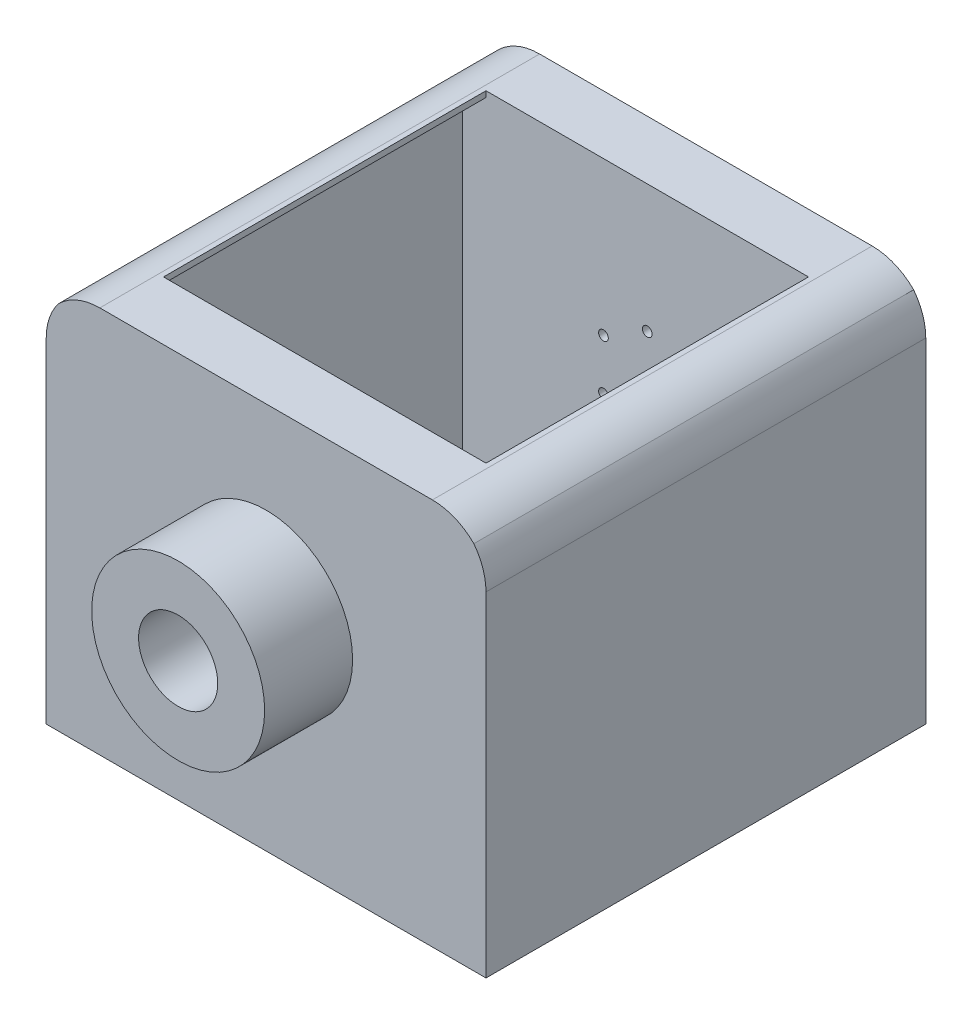
ISO-10303-21;
HEADER;
FILE_DESCRIPTION(('STEP AP214'),'2;1');
FILE_NAME('part.step','',(''),(''),'','','');
FILE_SCHEMA(('AUTOMOTIVE_DESIGN { 1 0 10303 214 1 1 1 1 }'));
ENDSEC;
DATA;
#1=APPLICATION_CONTEXT('core data for automotive mechanical design processes');
#2=APPLICATION_PROTOCOL_DEFINITION('international standard','automotive_design',2000,#1);
#3=PRODUCT_CONTEXT('',#1,'mechanical');
#4=PRODUCT('Part','Part','',(#3));
#5=PRODUCT_RELATED_PRODUCT_CATEGORY('part','',(#4));
#6=PRODUCT_DEFINITION_FORMATION('','',#4);
#7=PRODUCT_DEFINITION_CONTEXT('part definition',#1,'design');
#8=PRODUCT_DEFINITION('design','',#6,#7);
#9=PRODUCT_DEFINITION_SHAPE('','',#8);
#10=(LENGTH_UNIT() NAMED_UNIT(*) SI_UNIT(.MILLI.,.METRE.));
#11=(NAMED_UNIT(*) PLANE_ANGLE_UNIT() SI_UNIT($,.RADIAN.));
#12=(NAMED_UNIT(*) SI_UNIT($,.STERADIAN.) SOLID_ANGLE_UNIT());
#13=UNCERTAINTY_MEASURE_WITH_UNIT(LENGTH_MEASURE(1.E-05),#10,'distance_accuracy_value','');
#14=(GEOMETRIC_REPRESENTATION_CONTEXT(3) GLOBAL_UNCERTAINTY_ASSIGNED_CONTEXT((#13)) GLOBAL_UNIT_ASSIGNED_CONTEXT((#10,
#11,#12)) REPRESENTATION_CONTEXT('',''));
#15=CARTESIAN_POINT('',(0.,0.,0.));
#16=DIRECTION('',(0.,0.,1.));
#17=DIRECTION('',(1.,0.,0.));
#18=AXIS2_PLACEMENT_3D('',#15,#16,#17);
#19=CARTESIAN_POINT('',(0.,0.,-110.));
#20=DIRECTION('',(0.,0.,-1.));
#21=DIRECTION('',(-1.,0.,0.));
#22=AXIS2_PLACEMENT_3D('',#19,#20,#21);
#23=PLANE('',#22);
#24=DIRECTION('',(-1.,0.,0.));
#25=VECTOR('',#24,1.);
#26=CARTESIAN_POINT('',(0.,57.9144486749212,-110.));
#27=LINE('',#26,#25);
#28=CARTESIAN_POINT('',(63.,57.9144486749212,-110.));
#29=VERTEX_POINT('',#28);
#30=CARTESIAN_POINT('',(-63.,57.9144486749212,-110.));
#31=VERTEX_POINT('',#30);
#32=EDGE_CURVE('E123',#29,#31,#27,.T.);
#33=ORIENTED_EDGE('',*,*,#32,.F.);
#34=DIRECTION('',(0.,-1.,0.));
#35=VECTOR('',#34,1.);
#36=CARTESIAN_POINT('',(63.,200.,-110.));
#37=LINE('',#36,#35);
#38=CARTESIAN_POINT('',(63.,188.,-110.));
#39=VERTEX_POINT('',#38);
#40=EDGE_CURVE('E302',#39,#29,#37,.T.);
#41=ORIENTED_EDGE('',*,*,#40,.F.);
#42=DIRECTION('',(1.,0.,0.));
#43=VECTOR('',#42,1.);
#44=CARTESIAN_POINT('',(-75.,188.,-110.));
#45=LINE('',#44,#43);
#46=CARTESIAN_POINT('',(55.,188.,-110.));
#47=VERTEX_POINT('',#46);
#48=EDGE_CURVE('E263',#47,#39,#45,.T.);
#49=ORIENTED_EDGE('',*,*,#48,.F.);
#50=DIRECTION('',(0.,-1.,0.));
#51=VECTOR('',#50,1.);
#52=CARTESIAN_POINT('',(55.,200.,-110.));
#53=LINE('',#52,#51);
#54=CARTESIAN_POINT('',(55.,190.,-110.));
#55=VERTEX_POINT('',#54);
#56=EDGE_CURVE('E250',#55,#47,#53,.T.);
#57=ORIENTED_EDGE('',*,*,#56,.F.);
#58=DIRECTION('',(-1.,0.,0.));
#59=VECTOR('',#58,1.);
#60=CARTESIAN_POINT('',(0.,190.,-110.));
#61=LINE('',#60,#59);
#62=CARTESIAN_POINT('',(-55.,190.,-110.));
#63=VERTEX_POINT('',#62);
#64=EDGE_CURVE('E232',#55,#63,#61,.T.);
#65=ORIENTED_EDGE('',*,*,#64,.T.);
#66=DIRECTION('',(0.,-1.,0.));
#67=VECTOR('',#66,1.);
#68=CARTESIAN_POINT('',(-55.,200.,-110.));
#69=LINE('',#68,#67);
#70=CARTESIAN_POINT('',(-55.,188.,-110.));
#71=VERTEX_POINT('',#70);
#72=EDGE_CURVE('E247',#63,#71,#69,.T.);
#73=ORIENTED_EDGE('',*,*,#72,.T.);
#74=CARTESIAN_POINT('',(-63.,188.,-110.));
#75=VERTEX_POINT('',#74);
#76=EDGE_CURVE('E259',#75,#71,#45,.T.);
#77=ORIENTED_EDGE('',*,*,#76,.F.);
#78=DIRECTION('',(0.,1.,0.));
#79=VECTOR('',#78,1.);
#80=CARTESIAN_POINT('',(-63.,-200.,-110.));
#81=LINE('',#80,#79);
#82=EDGE_CURVE('E305',#31,#75,#81,.T.);
#83=ORIENTED_EDGE('',*,*,#82,.F.);
#84=EDGE_LOOP('',(#33,#41,#49,#57,#65,#73,#77,#83));
#85=FACE_BOUND('',#84,.T.);
#86=CARTESIAN_POINT('',(14.9389382152806,120.514909829688,-110.));
#87=DIRECTION('',(0.,0.,-1.));
#88=DIRECTION('',(-1.,0.,0.));
#89=AXIS2_PLACEMENT_3D('',#86,#87,#88);
#90=CIRCLE('',#89,1.65);
#91=CARTESIAN_POINT('',(13.2889382152806,120.514909829688,-110.));
#92=VERTEX_POINT('',#91);
#93=EDGE_CURVE('E424',#92,#92,#90,.F.);
#94=ORIENTED_EDGE('',*,*,#93,.F.);
#95=EDGE_LOOP('',(#94));
#96=FACE_BOUND('',#95,.T.);
#97=CARTESIAN_POINT('',(-1.31416171830358E-12,111.889909829688,-110.));
#98=DIRECTION('',(0.,0.,-1.));
#99=DIRECTION('',(-1.,0.,0.));
#100=AXIS2_PLACEMENT_3D('',#97,#98,#99);
#101=CIRCLE('',#100,1.65000000000001);
#102=CARTESIAN_POINT('',(-1.65000000000132,111.889909829688,-110.));
#103=VERTEX_POINT('',#102);
#104=EDGE_CURVE('E428',#103,#103,#101,.F.);
#105=ORIENTED_EDGE('',*,*,#104,.F.);
#106=EDGE_LOOP('',(#105));
#107=FACE_BOUND('',#106,.T.);
#108=CARTESIAN_POINT('',(-14.9389382152826,120.514909829689,-110.));
#109=DIRECTION('',(0.,0.,-1.));
#110=DIRECTION('',(-1.,0.,0.));
#111=AXIS2_PLACEMENT_3D('',#108,#109,#110);
#112=CIRCLE('',#111,1.65000000000001);
#113=CARTESIAN_POINT('',(-16.5889382152826,120.514909829689,-110.));
#114=VERTEX_POINT('',#113);
#115=EDGE_CURVE('E432',#114,#114,#112,.F.);
#116=ORIENTED_EDGE('',*,*,#115,.F.);
#117=EDGE_LOOP('',(#116));
#118=FACE_BOUND('',#117,.T.);
#119=CARTESIAN_POINT('',(-14.938938215282,137.764909829689,-110.));
#120=DIRECTION('',(0.,0.,-1.));
#121=DIRECTION('',(-1.,0.,0.));
#122=AXIS2_PLACEMENT_3D('',#119,#120,#121);
#123=CIRCLE('',#122,1.64999999999997);
#124=CARTESIAN_POINT('',(-16.588938215282,137.764909829689,-110.));
#125=VERTEX_POINT('',#124);
#126=EDGE_CURVE('E436',#125,#125,#123,.F.);
#127=ORIENTED_EDGE('',*,*,#126,.F.);
#128=EDGE_LOOP('',(#127));
#129=FACE_BOUND('',#128,.T.);
#130=CARTESIAN_POINT('',(0.,146.389909829688,-110.));
#131=DIRECTION('',(0.,0.,-1.));
#132=DIRECTION('',(-1.,0.,0.));
#133=AXIS2_PLACEMENT_3D('',#130,#131,#132);
#134=CIRCLE('',#133,1.65000000000001);
#135=CARTESIAN_POINT('',(-1.64999999999998,146.389909829688,-110.));
#136=VERTEX_POINT('',#135);
#137=EDGE_CURVE('E440',#136,#136,#134,.F.);
#138=ORIENTED_EDGE('',*,*,#137,.F.);
#139=EDGE_LOOP('',(#138));
#140=FACE_BOUND('',#139,.T.);
#141=CARTESIAN_POINT('',(14.9389382152812,137.764909829688,-110.));
#142=DIRECTION('',(0.,0.,-1.));
#143=DIRECTION('',(-1.,0.,0.));
#144=AXIS2_PLACEMENT_3D('',#141,#142,#143);
#145=CIRCLE('',#144,1.65);
#146=CARTESIAN_POINT('',(13.2889382152812,137.764909829688,-110.));
#147=VERTEX_POINT('',#146);
#148=EDGE_CURVE('E444',#147,#147,#145,.T.);
#149=ORIENTED_EDGE('',*,*,#148,.T.);
#150=EDGE_LOOP('',(#149));
#151=FACE_BOUND('',#150,.T.);
#152=ADVANCED_FACE('F113',(#85,#96,#107,#118,#129,#140,#151),#23,.F.);
#153=CARTESIAN_POINT('',(0.,0.,20.));
#154=DIRECTION('',(0.,0.,1.));
#155=DIRECTION('',(1.,0.,0.));
#156=AXIS2_PLACEMENT_3D('',#153,#154,#155);
#157=PLANE('',#156);
#158=CARTESIAN_POINT('',(0.,129.139909829688,20.));
#159=DIRECTION('',(0.,0.,1.));
#160=DIRECTION('',(1.,0.,0.));
#161=AXIS2_PLACEMENT_3D('',#158,#159,#160);
#162=CIRCLE('',#161,29.5);
#163=CARTESIAN_POINT('',(29.5,129.139909829688,20.));
#164=VERTEX_POINT('',#163);
#165=EDGE_CURVE('E392',#164,#164,#162,.T.);
#166=ORIENTED_EDGE('',*,*,#165,.F.);
#167=EDGE_LOOP('',(#166));
#168=FACE_BOUND('',#167,.T.);
#169=DIRECTION('',(0.,1.,0.));
#170=VECTOR('',#169,1.);
#171=CARTESIAN_POINT('',(-75.,-200.,20.));
#172=LINE('',#171,#170);
#173=CARTESIAN_POINT('',(-75.,57.9144486749212,20.));
#174=VERTEX_POINT('',#173);
#175=CARTESIAN_POINT('',(-75.,171.954923578975,20.));
#176=VERTEX_POINT('',#175);
#177=EDGE_CURVE('E321',#174,#176,#172,.T.);
#178=ORIENTED_EDGE('',*,*,#177,.F.);
#179=DIRECTION('',(1.,0.,0.));
#180=VECTOR('',#179,1.);
#181=CARTESIAN_POINT('',(0.,57.9144486749212,20.));
#182=LINE('',#181,#180);
#183=CARTESIAN_POINT('',(75.,57.9144486749212,20.));
#184=VERTEX_POINT('',#183);
#185=EDGE_CURVE('E146',#174,#184,#182,.T.);
#186=ORIENTED_EDGE('',*,*,#185,.T.);
#187=DIRECTION('',(0.,1.,0.));
#188=VECTOR('',#187,1.);
#189=CARTESIAN_POINT('',(75.,-200.,20.));
#190=LINE('',#189,#188);
#191=CARTESIAN_POINT('',(75.,171.954923578975,20.));
#192=VERTEX_POINT('',#191);
#193=EDGE_CURVE('E295',#184,#192,#190,.T.);
#194=ORIENTED_EDGE('',*,*,#193,.T.);
#195=CARTESIAN_POINT('',(55.,171.954923578975,20.));
#196=DIRECTION('',(0.,0.,1.));
#197=DIRECTION('',(1.,0.,0.));
#198=AXIS2_PLACEMENT_3D('',#195,#196,#197);
#199=CIRCLE('',#198,20.);
#200=CARTESIAN_POINT('',(70.857864376269,184.142135623731,20.));
#201=VERTEX_POINT('',#200);
#202=EDGE_CURVE('E327',#192,#201,#199,.T.);
#203=ORIENTED_EDGE('',*,*,#202,.T.);
#204=CARTESIAN_POINT('',(56.7157287525381,170.,20.));
#205=DIRECTION('',(0.,0.,1.));
#206=DIRECTION('',(1.,0.,0.));
#207=AXIS2_PLACEMENT_3D('',#204,#205,#206);
#208=CIRCLE('',#207,20.);
#209=CARTESIAN_POINT('',(56.7157287525381,190.,20.));
#210=VERTEX_POINT('',#209);
#211=EDGE_CURVE('E292',#201,#210,#208,.T.);
#212=ORIENTED_EDGE('',*,*,#211,.T.);
#213=DIRECTION('',(-1.,0.,0.));
#214=VECTOR('',#213,1.);
#215=CARTESIAN_POINT('',(65.,190.,20.));
#216=LINE('',#215,#214);
#217=CARTESIAN_POINT('',(-56.7157287525381,190.,20.));
#218=VERTEX_POINT('',#217);
#219=EDGE_CURVE('E288',#210,#218,#216,.T.);
#220=ORIENTED_EDGE('',*,*,#219,.T.);
#221=CARTESIAN_POINT('',(-56.7157287525381,170.,20.));
#222=DIRECTION('',(0.,0.,1.));
#223=DIRECTION('',(1.,0.,0.));
#224=AXIS2_PLACEMENT_3D('',#221,#222,#223);
#225=CIRCLE('',#224,20.);
#226=CARTESIAN_POINT('',(-70.8578643762689,184.142135623731,20.));
#227=VERTEX_POINT('',#226);
#228=EDGE_CURVE('E291',#218,#227,#225,.T.);
#229=ORIENTED_EDGE('',*,*,#228,.T.);
#230=CARTESIAN_POINT('',(-55.,171.954923578975,20.));
#231=DIRECTION('',(0.,0.,1.));
#232=DIRECTION('',(1.,0.,0.));
#233=AXIS2_PLACEMENT_3D('',#230,#231,#232);
#234=CIRCLE('',#233,20.);
#235=EDGE_CURVE('E337',#227,#176,#234,.T.);
#236=ORIENTED_EDGE('',*,*,#235,.T.);
#237=EDGE_LOOP('',(#178,#186,#194,#203,#212,#220,#229,#236));
#238=FACE_BOUND('',#237,.T.);
#239=ADVANCED_FACE('F115',(#168,#238),#157,.T.);
#240=CARTESIAN_POINT('',(0.,0.,0.));
#241=DIRECTION('',(0.,0.,1.));
#242=DIRECTION('',(1.,0.,0.));
#243=AXIS2_PLACEMENT_3D('',#240,#241,#242);
#244=PLANE('',#243);
#245=DIRECTION('',(1.,0.,0.));
#246=VECTOR('',#245,1.);
#247=CARTESIAN_POINT('',(0.,57.9144486749212,0.));
#248=LINE('',#247,#246);
#249=CARTESIAN_POINT('',(-63.,57.9144486749212,0.));
#250=VERTEX_POINT('',#249);
#251=CARTESIAN_POINT('',(63.,57.9144486749212,0.));
#252=VERTEX_POINT('',#251);
#253=EDGE_CURVE('E149',#250,#252,#248,.T.);
#254=ORIENTED_EDGE('',*,*,#253,.F.);
#255=DIRECTION('',(0.,1.,0.));
#256=VECTOR('',#255,1.);
#257=CARTESIAN_POINT('',(-63.,-200.,0.));
#258=LINE('',#257,#256);
#259=CARTESIAN_POINT('',(-63.,188.,0.));
#260=VERTEX_POINT('',#259);
#261=EDGE_CURVE('E334',#250,#260,#258,.T.);
#262=ORIENTED_EDGE('',*,*,#261,.T.);
#263=DIRECTION('',(1.,0.,0.));
#264=VECTOR('',#263,1.);
#265=CARTESIAN_POINT('',(-75.,188.,0.));
#266=LINE('',#265,#264);
#267=CARTESIAN_POINT('',(-55.,188.,0.));
#268=VERTEX_POINT('',#267);
#269=EDGE_CURVE('E283',#260,#268,#266,.T.);
#270=ORIENTED_EDGE('',*,*,#269,.T.);
#271=DIRECTION('',(0.,-1.,0.));
#272=VECTOR('',#271,1.);
#273=CARTESIAN_POINT('',(-55.,200.,0.));
#274=LINE('',#273,#272);
#275=CARTESIAN_POINT('',(-55.,190.,0.));
#276=VERTEX_POINT('',#275);
#277=EDGE_CURVE('E275',#276,#268,#274,.T.);
#278=ORIENTED_EDGE('',*,*,#277,.F.);
#279=DIRECTION('',(1.,0.,0.));
#280=VECTOR('',#279,1.);
#281=CARTESIAN_POINT('',(0.,190.,0.));
#282=LINE('',#281,#280);
#283=CARTESIAN_POINT('',(55.,190.,0.));
#284=VERTEX_POINT('',#283);
#285=EDGE_CURVE('E235',#276,#284,#282,.T.);
#286=ORIENTED_EDGE('',*,*,#285,.T.);
#287=DIRECTION('',(0.,-1.,0.));
#288=VECTOR('',#287,1.);
#289=CARTESIAN_POINT('',(55.,200.,0.));
#290=LINE('',#289,#288);
#291=CARTESIAN_POINT('',(55.,188.,0.));
#292=VERTEX_POINT('',#291);
#293=EDGE_CURVE('E271',#284,#292,#290,.T.);
#294=ORIENTED_EDGE('',*,*,#293,.T.);
#295=CARTESIAN_POINT('',(63.,188.,0.));
#296=VERTEX_POINT('',#295);
#297=EDGE_CURVE('E274',#292,#296,#266,.T.);
#298=ORIENTED_EDGE('',*,*,#297,.T.);
#299=DIRECTION('',(0.,-1.,0.));
#300=VECTOR('',#299,1.);
#301=CARTESIAN_POINT('',(63.,200.,0.));
#302=LINE('',#301,#300);
#303=EDGE_CURVE('E314',#296,#252,#302,.T.);
#304=ORIENTED_EDGE('',*,*,#303,.T.);
#305=EDGE_LOOP('',(#254,#262,#270,#278,#286,#294,#298,#304));
#306=FACE_BOUND('',#305,.T.);
#307=ADVANCED_FACE('F377',(#306),#244,.F.);
#308=CARTESIAN_POINT('',(75.,-200.,20.));
#309=DIRECTION('',(-1.,0.,0.));
#310=DIRECTION('',(0.,0.,1.));
#311=AXIS2_PLACEMENT_3D('',#308,#309,#310);
#312=PLANE('',#311);
#313=DIRECTION('',(0.,0.,-1.));
#314=VECTOR('',#313,1.);
#315=CARTESIAN_POINT('',(75.,57.9144486749212,30.));
#316=LINE('',#315,#314);
#317=CARTESIAN_POINT('',(75.,57.9144486749212,-130.));
#318=VERTEX_POINT('',#317);
#319=EDGE_CURVE('E309',#184,#318,#316,.T.);
#320=ORIENTED_EDGE('',*,*,#319,.T.);
#321=DIRECTION('',(0.,-1.,0.));
#322=VECTOR('',#321,1.);
#323=CARTESIAN_POINT('',(75.,200.,-130.));
#324=LINE('',#323,#322);
#325=CARTESIAN_POINT('',(75.,171.954923578975,-130.));
#326=VERTEX_POINT('',#325);
#327=EDGE_CURVE('E320',#326,#318,#324,.T.);
#328=ORIENTED_EDGE('',*,*,#327,.F.);
#329=DIRECTION('',(0.,0.,-1.));
#330=VECTOR('',#329,1.);
#331=CARTESIAN_POINT('',(75.,171.954923578975,20.));
#332=LINE('',#331,#330);
#333=EDGE_CURVE('E313',#326,#192,#332,.F.);
#334=ORIENTED_EDGE('',*,*,#333,.T.);
#335=ORIENTED_EDGE('',*,*,#193,.F.);
#336=EDGE_LOOP('',(#320,#328,#334,#335));
#337=FACE_BOUND('',#336,.T.);
#338=ADVANCED_FACE('F498',(#337),#312,.F.);
#339=CARTESIAN_POINT('',(-75.,-200.,20.));
#340=DIRECTION('',(-1.,0.,0.));
#341=DIRECTION('',(0.,0.,1.));
#342=AXIS2_PLACEMENT_3D('',#339,#340,#341);
#343=PLANE('',#342);
#344=DIRECTION('',(0.,1.,0.));
#345=VECTOR('',#344,1.);
#346=CARTESIAN_POINT('',(-75.,-200.,-130.));
#347=LINE('',#346,#345);
#348=CARTESIAN_POINT('',(-75.,57.9144486749212,-130.));
#349=VERTEX_POINT('',#348);
#350=CARTESIAN_POINT('',(-75.,171.954923578975,-130.));
#351=VERTEX_POINT('',#350);
#352=EDGE_CURVE('E319',#349,#351,#347,.T.);
#353=ORIENTED_EDGE('',*,*,#352,.F.);
#354=DIRECTION('',(0.,0.,-1.));
#355=VECTOR('',#354,1.);
#356=CARTESIAN_POINT('',(-75.,57.9144486749212,30.));
#357=LINE('',#356,#355);
#358=EDGE_CURVE('E299',#174,#349,#357,.T.);
#359=ORIENTED_EDGE('',*,*,#358,.F.);
#360=ORIENTED_EDGE('',*,*,#177,.T.);
#361=DIRECTION('',(0.,0.,1.));
#362=VECTOR('',#361,1.);
#363=CARTESIAN_POINT('',(-75.,171.954923578975,-130.));
#364=LINE('',#363,#362);
#365=EDGE_CURVE('E324',#176,#351,#364,.F.);
#366=ORIENTED_EDGE('',*,*,#365,.T.);
#367=EDGE_LOOP('',(#353,#359,#360,#366));
#368=FACE_BOUND('',#367,.T.);
#369=ADVANCED_FACE('F508',(#368),#343,.T.);
#370=CARTESIAN_POINT('',(63.,200.,-110.));
#371=DIRECTION('',(-1.,0.,0.));
#372=DIRECTION('',(0.,0.,1.));
#373=AXIS2_PLACEMENT_3D('',#370,#371,#372);
#374=PLANE('',#373);
#375=ORIENTED_EDGE('',*,*,#40,.T.);
#376=DIRECTION('',(0.,0.,1.));
#377=VECTOR('',#376,1.);
#378=CARTESIAN_POINT('',(63.,57.9144486749212,-110.));
#379=LINE('',#378,#377);
#380=EDGE_CURVE('E152',#29,#252,#379,.T.);
#381=ORIENTED_EDGE('',*,*,#380,.T.);
#382=ORIENTED_EDGE('',*,*,#303,.F.);
#383=DIRECTION('',(0.,0.,1.));
#384=VECTOR('',#383,1.);
#385=CARTESIAN_POINT('',(63.,188.,-110.));
#386=LINE('',#385,#384);
#387=EDGE_CURVE('E281',#39,#296,#386,.T.);
#388=ORIENTED_EDGE('',*,*,#387,.F.);
#389=EDGE_LOOP('',(#375,#381,#382,#388));
#390=FACE_BOUND('',#389,.T.);
#391=ADVANCED_FACE('F375',(#390),#374,.T.);
#392=CARTESIAN_POINT('',(-63.,-200.,-110.));
#393=DIRECTION('',(1.,0.,0.));
#394=DIRECTION('',(0.,0.,-1.));
#395=AXIS2_PLACEMENT_3D('',#392,#393,#394);
#396=PLANE('',#395);
#397=ORIENTED_EDGE('',*,*,#261,.F.);
#398=DIRECTION('',(0.,0.,-1.));
#399=VECTOR('',#398,1.);
#400=CARTESIAN_POINT('',(-63.,57.9144486749212,-110.));
#401=LINE('',#400,#399);
#402=EDGE_CURVE('E131',#250,#31,#401,.T.);
#403=ORIENTED_EDGE('',*,*,#402,.T.);
#404=ORIENTED_EDGE('',*,*,#82,.T.);
#405=DIRECTION('',(0.,0.,1.));
#406=VECTOR('',#405,1.);
#407=CARTESIAN_POINT('',(-63.,188.,-110.));
#408=LINE('',#407,#406);
#409=EDGE_CURVE('E330',#75,#260,#408,.T.);
#410=ORIENTED_EDGE('',*,*,#409,.T.);
#411=EDGE_LOOP('',(#397,#403,#404,#410));
#412=FACE_BOUND('',#411,.T.);
#413=ADVANCED_FACE('F518',(#412),#396,.T.);
#414=CARTESIAN_POINT('',(0.,0.,-130.));
#415=DIRECTION('',(0.,0.,-1.));
#416=DIRECTION('',(-1.,0.,0.));
#417=AXIS2_PLACEMENT_3D('',#414,#415,#416);
#418=PLANE('',#417);
#419=CARTESIAN_POINT('',(14.9389382152812,137.764909829688,-130.));
#420=DIRECTION('',(0.,0.,-1.));
#421=DIRECTION('',(-1.,0.,0.));
#422=AXIS2_PLACEMENT_3D('',#419,#420,#421);
#423=CIRCLE('',#422,1.65);
#424=CARTESIAN_POINT('',(13.2889382152812,137.764909829688,-130.));
#425=VERTEX_POINT('',#424);
#426=EDGE_CURVE('E420',#425,#425,#423,.T.);
#427=ORIENTED_EDGE('',*,*,#426,.F.);
#428=EDGE_LOOP('',(#427));
#429=FACE_BOUND('',#428,.T.);
#430=CARTESIAN_POINT('',(14.9389382152806,120.514909829688,-130.));
#431=DIRECTION('',(0.,0.,-1.));
#432=DIRECTION('',(-1.,0.,0.));
#433=AXIS2_PLACEMENT_3D('',#430,#431,#432);
#434=CIRCLE('',#433,1.65);
#435=CARTESIAN_POINT('',(13.2889382152806,120.514909829688,-130.));
#436=VERTEX_POINT('',#435);
#437=EDGE_CURVE('E416',#436,#436,#434,.F.);
#438=ORIENTED_EDGE('',*,*,#437,.T.);
#439=EDGE_LOOP('',(#438));
#440=FACE_BOUND('',#439,.T.);
#441=CARTESIAN_POINT('',(-1.31416171830358E-12,111.889909829688,-130.));
#442=DIRECTION('',(0.,0.,-1.));
#443=DIRECTION('',(-1.,0.,0.));
#444=AXIS2_PLACEMENT_3D('',#441,#442,#443);
#445=CIRCLE('',#444,1.65000000000001);
#446=CARTESIAN_POINT('',(-1.65000000000132,111.889909829688,-130.));
#447=VERTEX_POINT('',#446);
#448=EDGE_CURVE('E412',#447,#447,#445,.F.);
#449=ORIENTED_EDGE('',*,*,#448,.T.);
#450=EDGE_LOOP('',(#449));
#451=FACE_BOUND('',#450,.T.);
#452=CARTESIAN_POINT('',(-14.9389382152826,120.514909829689,-130.));
#453=DIRECTION('',(0.,0.,-1.));
#454=DIRECTION('',(-1.,0.,0.));
#455=AXIS2_PLACEMENT_3D('',#452,#453,#454);
#456=CIRCLE('',#455,1.65000000000001);
#457=CARTESIAN_POINT('',(-16.5889382152826,120.514909829689,-130.));
#458=VERTEX_POINT('',#457);
#459=EDGE_CURVE('E408',#458,#458,#456,.F.);
#460=ORIENTED_EDGE('',*,*,#459,.T.);
#461=EDGE_LOOP('',(#460));
#462=FACE_BOUND('',#461,.T.);
#463=CARTESIAN_POINT('',(-14.938938215282,137.764909829689,-130.));
#464=DIRECTION('',(0.,0.,-1.));
#465=DIRECTION('',(-1.,0.,0.));
#466=AXIS2_PLACEMENT_3D('',#463,#464,#465);
#467=CIRCLE('',#466,1.64999999999997);
#468=CARTESIAN_POINT('',(-16.588938215282,137.764909829689,-130.));
#469=VERTEX_POINT('',#468);
#470=EDGE_CURVE('E404',#469,#469,#467,.F.);
#471=ORIENTED_EDGE('',*,*,#470,.T.);
#472=EDGE_LOOP('',(#471));
#473=FACE_BOUND('',#472,.T.);
#474=CARTESIAN_POINT('',(0.,146.389909829688,-130.));
#475=DIRECTION('',(0.,0.,-1.));
#476=DIRECTION('',(-1.,0.,0.));
#477=AXIS2_PLACEMENT_3D('',#474,#475,#476);
#478=CIRCLE('',#477,1.65000000000001);
#479=CARTESIAN_POINT('',(-1.64999999999998,146.389909829688,-130.));
#480=VERTEX_POINT('',#479);
#481=EDGE_CURVE('E400',#480,#480,#478,.F.);
#482=ORIENTED_EDGE('',*,*,#481,.T.);
#483=EDGE_LOOP('',(#482));
#484=FACE_BOUND('',#483,.T.);
#485=ORIENTED_EDGE('',*,*,#327,.T.);
#486=DIRECTION('',(-1.,0.,0.));
#487=VECTOR('',#486,1.);
#488=CARTESIAN_POINT('',(75.,57.9144486749212,-130.));
#489=LINE('',#488,#487);
#490=EDGE_CURVE('E315',#318,#349,#489,.T.);
#491=ORIENTED_EDGE('',*,*,#490,.T.);
#492=ORIENTED_EDGE('',*,*,#352,.T.);
#493=CARTESIAN_POINT('',(-55.,171.954923578975,-130.));
#494=DIRECTION('',(0.,0.,-1.));
#495=DIRECTION('',(-1.,0.,0.));
#496=AXIS2_PLACEMENT_3D('',#493,#494,#495);
#497=CIRCLE('',#496,20.);
#498=CARTESIAN_POINT('',(-70.8578643762689,184.142135623731,-130.));
#499=VERTEX_POINT('',#498);
#500=EDGE_CURVE('E342',#351,#499,#497,.T.);
#501=ORIENTED_EDGE('',*,*,#500,.T.);
#502=CARTESIAN_POINT('',(-56.7157287525381,170.,-130.));
#503=DIRECTION('',(0.,0.,-1.));
#504=DIRECTION('',(-1.,0.,0.));
#505=AXIS2_PLACEMENT_3D('',#502,#503,#504);
#506=CIRCLE('',#505,20.);
#507=CARTESIAN_POINT('',(-56.7157287525381,190.,-130.));
#508=VERTEX_POINT('',#507);
#509=EDGE_CURVE('E461',#499,#508,#506,.T.);
#510=ORIENTED_EDGE('',*,*,#509,.T.);
#511=DIRECTION('',(-1.,0.,0.));
#512=VECTOR('',#511,1.);
#513=CARTESIAN_POINT('',(65.,190.,-130.));
#514=LINE('',#513,#512);
#515=CARTESIAN_POINT('',(56.7157287525381,190.,-130.));
#516=VERTEX_POINT('',#515);
#517=EDGE_CURVE('E285',#516,#508,#514,.T.);
#518=ORIENTED_EDGE('',*,*,#517,.F.);
#519=CARTESIAN_POINT('',(56.7157287525381,170.,-130.));
#520=DIRECTION('',(0.,0.,-1.));
#521=DIRECTION('',(-1.,0.,0.));
#522=AXIS2_PLACEMENT_3D('',#519,#520,#521);
#523=CIRCLE('',#522,20.);
#524=CARTESIAN_POINT('',(70.857864376269,184.142135623731,-130.));
#525=VERTEX_POINT('',#524);
#526=EDGE_CURVE('E454',#516,#525,#523,.T.);
#527=ORIENTED_EDGE('',*,*,#526,.T.);
#528=CARTESIAN_POINT('',(55.,171.954923578975,-130.));
#529=DIRECTION('',(0.,0.,-1.));
#530=DIRECTION('',(-1.,0.,0.));
#531=AXIS2_PLACEMENT_3D('',#528,#529,#530);
#532=CIRCLE('',#531,20.);
#533=EDGE_CURVE('E252',#525,#326,#532,.T.);
#534=ORIENTED_EDGE('',*,*,#533,.T.);
#535=EDGE_LOOP('',(#485,#491,#492,#501,#510,#518,#527,#534));
#536=FACE_BOUND('',#535,.T.);
#537=ADVANCED_FACE('F480',(#429,#440,#451,#462,#473,#484,#536),#418,.T.);
#538=CARTESIAN_POINT('',(-75.,188.,-110.));
#539=DIRECTION('',(0.,-1.,0.));
#540=DIRECTION('',(0.,0.,-1.));
#541=AXIS2_PLACEMENT_3D('',#538,#539,#540);
#542=PLANE('',#541);
#543=ORIENTED_EDGE('',*,*,#76,.T.);
#544=DIRECTION('',(0.,0.,1.));
#545=VECTOR('',#544,1.);
#546=CARTESIAN_POINT('',(-55.,188.,-110.));
#547=LINE('',#546,#545);
#548=EDGE_CURVE('E256',#71,#268,#547,.T.);
#549=ORIENTED_EDGE('',*,*,#548,.T.);
#550=ORIENTED_EDGE('',*,*,#269,.F.);
#551=ORIENTED_EDGE('',*,*,#409,.F.);
#552=EDGE_LOOP('',(#543,#549,#550,#551));
#553=FACE_BOUND('',#552,.T.);
#554=ADVANCED_FACE('F517',(#553),#542,.T.);
#555=DIRECTION('',(0.,0.,1.));
#556=VECTOR('',#555,1.);
#557=CARTESIAN_POINT('',(55.,188.,-110.));
#558=LINE('',#557,#556);
#559=EDGE_CURVE('E266',#47,#292,#558,.T.);
#560=ORIENTED_EDGE('',*,*,#559,.F.);
#561=ORIENTED_EDGE('',*,*,#48,.T.);
#562=ORIENTED_EDGE('',*,*,#387,.T.);
#563=ORIENTED_EDGE('',*,*,#297,.F.);
#564=EDGE_LOOP('',(#560,#561,#562,#563));
#565=FACE_BOUND('',#564,.T.);
#566=ADVANCED_FACE('F368',(#565),#542,.T.);
#567=CARTESIAN_POINT('',(55.,200.,0.));
#568=DIRECTION('',(1.,0.,0.));
#569=DIRECTION('',(0.,0.,-1.));
#570=AXIS2_PLACEMENT_3D('',#567,#568,#569);
#571=PLANE('',#570);
#572=ORIENTED_EDGE('',*,*,#293,.F.);
#573=DIRECTION('',(0.,0.,-1.));
#574=VECTOR('',#573,1.);
#575=CARTESIAN_POINT('',(55.,190.,0.));
#576=LINE('',#575,#574);
#577=EDGE_CURVE('E270',#284,#55,#576,.T.);
#578=ORIENTED_EDGE('',*,*,#577,.T.);
#579=ORIENTED_EDGE('',*,*,#56,.T.);
#580=ORIENTED_EDGE('',*,*,#559,.T.);
#581=EDGE_LOOP('',(#572,#578,#579,#580));
#582=FACE_BOUND('',#581,.T.);
#583=ADVANCED_FACE('F516',(#582),#571,.F.);
#584=CARTESIAN_POINT('',(-55.,200.,0.));
#585=DIRECTION('',(1.,0.,0.));
#586=DIRECTION('',(0.,0.,-1.));
#587=AXIS2_PLACEMENT_3D('',#584,#585,#586);
#588=PLANE('',#587);
#589=DIRECTION('',(0.,0.,-1.));
#590=VECTOR('',#589,1.);
#591=CARTESIAN_POINT('',(-55.,190.,0.));
#592=LINE('',#591,#590);
#593=EDGE_CURVE('E229',#276,#63,#592,.T.);
#594=ORIENTED_EDGE('',*,*,#593,.F.);
#595=ORIENTED_EDGE('',*,*,#277,.T.);
#596=ORIENTED_EDGE('',*,*,#548,.F.);
#597=ORIENTED_EDGE('',*,*,#72,.F.);
#598=EDGE_LOOP('',(#594,#595,#596,#597));
#599=FACE_BOUND('',#598,.T.);
#600=ADVANCED_FACE('F254',(#599),#588,.T.);
#601=CARTESIAN_POINT('',(65.,190.,20.));
#602=DIRECTION('',(0.,-1.,0.));
#603=DIRECTION('',(0.,0.,-1.));
#604=AXIS2_PLACEMENT_3D('',#601,#602,#603);
#605=PLANE('',#604);
#606=ORIENTED_EDGE('',*,*,#219,.F.);
#607=DIRECTION('',(0.,0.,-1.));
#608=VECTOR('',#607,1.);
#609=CARTESIAN_POINT('',(56.7157287525381,190.,-130.));
#610=LINE('',#609,#608);
#611=EDGE_CURVE('E278',#210,#516,#610,.T.);
#612=ORIENTED_EDGE('',*,*,#611,.T.);
#613=ORIENTED_EDGE('',*,*,#517,.T.);
#614=DIRECTION('',(0.,0.,1.));
#615=VECTOR('',#614,1.);
#616=CARTESIAN_POINT('',(-56.7157287525381,190.,20.));
#617=LINE('',#616,#615);
#618=EDGE_CURVE('E241',#508,#218,#617,.T.);
#619=ORIENTED_EDGE('',*,*,#618,.T.);
#620=EDGE_LOOP('',(#606,#612,#613,#619));
#621=FACE_BOUND('',#620,.T.);
#622=ORIENTED_EDGE('',*,*,#285,.F.);
#623=ORIENTED_EDGE('',*,*,#593,.T.);
#624=ORIENTED_EDGE('',*,*,#64,.F.);
#625=ORIENTED_EDGE('',*,*,#577,.F.);
#626=EDGE_LOOP('',(#622,#623,#624,#625));
#627=FACE_BOUND('',#626,.T.);
#628=ADVANCED_FACE('F231',(#621,#627),#605,.F.);
#629=CARTESIAN_POINT('',(-56.7157287525381,170.,20.));
#630=DIRECTION('',(0.,0.,-1.));
#631=DIRECTION('',(-1.,0.,0.));
#632=AXIS2_PLACEMENT_3D('',#629,#630,#631);
#633=CYLINDRICAL_SURFACE('',#632,20.);
#634=ORIENTED_EDGE('',*,*,#228,.F.);
#635=ORIENTED_EDGE('',*,*,#618,.F.);
#636=ORIENTED_EDGE('',*,*,#509,.F.);
#637=DIRECTION('',(0.,0.,-1.));
#638=VECTOR('',#637,1.);
#639=CARTESIAN_POINT('',(-70.857864376269,184.142135623731,-130.));
#640=LINE('',#639,#638);
#641=EDGE_CURVE('E240',#227,#499,#640,.T.);
#642=ORIENTED_EDGE('',*,*,#641,.F.);
#643=EDGE_LOOP('',(#634,#635,#636,#642));
#644=FACE_BOUND('',#643,.T.);
#645=ADVANCED_FACE('F486',(#644),#633,.T.);
#646=CARTESIAN_POINT('',(56.7157287525381,170.,20.));
#647=DIRECTION('',(0.,0.,1.));
#648=DIRECTION('',(1.,0.,0.));
#649=AXIS2_PLACEMENT_3D('',#646,#647,#648);
#650=CYLINDRICAL_SURFACE('',#649,20.);
#651=ORIENTED_EDGE('',*,*,#211,.F.);
#652=DIRECTION('',(0.,0.,-1.));
#653=VECTOR('',#652,1.);
#654=CARTESIAN_POINT('',(70.8578643762691,184.142135623731,20.));
#655=LINE('',#654,#653);
#656=EDGE_CURVE('E308',#525,#201,#655,.F.);
#657=ORIENTED_EDGE('',*,*,#656,.F.);
#658=ORIENTED_EDGE('',*,*,#526,.F.);
#659=ORIENTED_EDGE('',*,*,#611,.F.);
#660=EDGE_LOOP('',(#651,#657,#658,#659));
#661=FACE_BOUND('',#660,.T.);
#662=ADVANCED_FACE('F492',(#661),#650,.T.);
#663=CARTESIAN_POINT('',(-55.,171.954923578975,20.));
#664=DIRECTION('',(0.,0.,-1.));
#665=DIRECTION('',(-1.,0.,0.));
#666=AXIS2_PLACEMENT_3D('',#663,#664,#665);
#667=CYLINDRICAL_SURFACE('',#666,20.);
#668=ORIENTED_EDGE('',*,*,#235,.F.);
#669=ORIENTED_EDGE('',*,*,#641,.T.);
#670=ORIENTED_EDGE('',*,*,#500,.F.);
#671=ORIENTED_EDGE('',*,*,#365,.F.);
#672=EDGE_LOOP('',(#668,#669,#670,#671));
#673=FACE_BOUND('',#672,.T.);
#674=ADVANCED_FACE('F512',(#673),#667,.T.);
#675=CARTESIAN_POINT('',(55.,171.954923578975,20.));
#676=DIRECTION('',(0.,0.,-1.));
#677=DIRECTION('',(-1.,0.,0.));
#678=AXIS2_PLACEMENT_3D('',#675,#676,#677);
#679=CYLINDRICAL_SURFACE('',#678,20.);
#680=ORIENTED_EDGE('',*,*,#533,.F.);
#681=ORIENTED_EDGE('',*,*,#656,.T.);
#682=ORIENTED_EDGE('',*,*,#202,.F.);
#683=ORIENTED_EDGE('',*,*,#333,.F.);
#684=EDGE_LOOP('',(#680,#681,#682,#683));
#685=FACE_BOUND('',#684,.T.);
#686=ADVANCED_FACE('F501',(#685),#679,.T.);
#687=CARTESIAN_POINT('',(75.,57.9144486749212,30.));
#688=DIRECTION('',(0.,-1.,0.));
#689=DIRECTION('',(0.,0.,-1.));
#690=AXIS2_PLACEMENT_3D('',#687,#688,#689);
#691=PLANE('',#690);
#692=ORIENTED_EDGE('',*,*,#358,.T.);
#693=ORIENTED_EDGE('',*,*,#490,.F.);
#694=ORIENTED_EDGE('',*,*,#319,.F.);
#695=ORIENTED_EDGE('',*,*,#185,.F.);
#696=EDGE_LOOP('',(#692,#693,#694,#695));
#697=FACE_BOUND('',#696,.T.);
#698=ORIENTED_EDGE('',*,*,#253,.T.);
#699=ORIENTED_EDGE('',*,*,#380,.F.);
#700=ORIENTED_EDGE('',*,*,#32,.T.);
#701=ORIENTED_EDGE('',*,*,#402,.F.);
#702=EDGE_LOOP('',(#698,#699,#700,#701));
#703=FACE_BOUND('',#702,.T.);
#704=ADVANCED_FACE('F510',(#697,#703),#691,.T.);
#705=CARTESIAN_POINT('',(0.,129.139909829688,50.));
#706=DIRECTION('',(0.,0.,1.));
#707=DIRECTION('',(1.,0.,0.));
#708=AXIS2_PLACEMENT_3D('',#705,#706,#707);
#709=PLANE('',#708);
#710=CARTESIAN_POINT('',(0.,129.139909829688,50.));
#711=DIRECTION('',(0.,0.,1.));
#712=DIRECTION('',(1.,0.,0.));
#713=AXIS2_PLACEMENT_3D('',#710,#711,#712);
#714=CIRCLE('',#713,29.5);
#715=CARTESIAN_POINT('',(29.5,129.139909829688,50.));
#716=VERTEX_POINT('',#715);
#717=EDGE_CURVE('E296',#716,#716,#714,.T.);
#718=ORIENTED_EDGE('',*,*,#717,.T.);
#719=EDGE_LOOP('',(#718));
#720=FACE_BOUND('',#719,.T.);
#721=CARTESIAN_POINT('',(0.,129.139909829688,50.));
#722=DIRECTION('',(0.,0.,1.));
#723=DIRECTION('',(1.,0.,0.));
#724=AXIS2_PLACEMENT_3D('',#721,#722,#723);
#725=CIRCLE('',#724,13.5);
#726=CARTESIAN_POINT('',(13.5,129.139909829688,50.));
#727=VERTEX_POINT('',#726);
#728=EDGE_CURVE('E396',#727,#727,#725,.T.);
#729=ORIENTED_EDGE('',*,*,#728,.F.);
#730=EDGE_LOOP('',(#729));
#731=FACE_BOUND('',#730,.T.);
#732=ADVANCED_FACE('F540',(#720,#731),#709,.T.);
#733=CARTESIAN_POINT('',(0.,129.139909829688,50.));
#734=DIRECTION('',(0.,0.,-1.));
#735=DIRECTION('',(-1.,0.,0.));
#736=AXIS2_PLACEMENT_3D('',#733,#734,#735);
#737=CYLINDRICAL_SURFACE('',#736,29.5);
#738=ORIENTED_EDGE('',*,*,#717,.F.);
#739=EDGE_LOOP('',(#738));
#740=FACE_BOUND('',#739,.T.);
#741=ORIENTED_EDGE('',*,*,#165,.T.);
#742=EDGE_LOOP('',(#741));
#743=FACE_BOUND('',#742,.T.);
#744=ADVANCED_FACE('F557',(#740,#743),#737,.T.);
#745=CARTESIAN_POINT('',(0.,129.139909829688,50.));
#746=DIRECTION('',(0.,0.,-1.));
#747=DIRECTION('',(-1.,0.,0.));
#748=AXIS2_PLACEMENT_3D('',#745,#746,#747);
#749=CYLINDRICAL_SURFACE('',#748,13.5);
#750=ORIENTED_EDGE('',*,*,#728,.T.);
#751=EDGE_LOOP('',(#750));
#752=FACE_BOUND('',#751,.T.);
#753=CARTESIAN_POINT('',(0.,129.139909829688,20.));
#754=DIRECTION('',(0.,0.,1.));
#755=DIRECTION('',(1.,0.,0.));
#756=AXIS2_PLACEMENT_3D('',#753,#754,#755);
#757=CIRCLE('',#756,13.5);
#758=CARTESIAN_POINT('',(13.5,129.139909829688,20.));
#759=VERTEX_POINT('',#758);
#760=EDGE_CURVE('E12',#759,#759,#757,.F.);
#761=ORIENTED_EDGE('',*,*,#760,.T.);
#762=EDGE_LOOP('',(#761));
#763=FACE_BOUND('',#762,.T.);
#764=ADVANCED_FACE('F560',(#752,#763),#749,.F.);
#765=ORIENTED_EDGE('',*,*,#760,.F.);
#766=EDGE_LOOP('',(#765));
#767=FACE_BOUND('',#766,.T.);
#768=ADVANCED_FACE('F536',(#767),#157,.T.);
#769=CARTESIAN_POINT('',(14.9389382152806,120.514909829688,-140.));
#770=DIRECTION('',(0.,0.,1.));
#771=DIRECTION('',(1.,0.,0.));
#772=AXIS2_PLACEMENT_3D('',#769,#770,#771);
#773=CYLINDRICAL_SURFACE('',#772,1.65);
#774=ORIENTED_EDGE('',*,*,#437,.F.);
#775=EDGE_LOOP('',(#774));
#776=FACE_BOUND('',#775,.T.);
#777=ORIENTED_EDGE('',*,*,#93,.T.);
#778=EDGE_LOOP('',(#777));
#779=FACE_BOUND('',#778,.T.);
#780=ADVANCED_FACE('F568',(#776,#779),#773,.F.);
#781=CARTESIAN_POINT('',(-1.31416171830358E-12,111.889909829688,-140.));
#782=DIRECTION('',(0.,0.,1.));
#783=DIRECTION('',(1.,0.,0.));
#784=AXIS2_PLACEMENT_3D('',#781,#782,#783);
#785=CYLINDRICAL_SURFACE('',#784,1.65000000000001);
#786=ORIENTED_EDGE('',*,*,#448,.F.);
#787=EDGE_LOOP('',(#786));
#788=FACE_BOUND('',#787,.T.);
#789=ORIENTED_EDGE('',*,*,#104,.T.);
#790=EDGE_LOOP('',(#789));
#791=FACE_BOUND('',#790,.T.);
#792=ADVANCED_FACE('F570',(#788,#791),#785,.F.);
#793=CARTESIAN_POINT('',(-14.9389382152826,120.514909829689,-140.));
#794=DIRECTION('',(0.,0.,1.));
#795=DIRECTION('',(1.,0.,0.));
#796=AXIS2_PLACEMENT_3D('',#793,#794,#795);
#797=CYLINDRICAL_SURFACE('',#796,1.65000000000001);
#798=ORIENTED_EDGE('',*,*,#459,.F.);
#799=EDGE_LOOP('',(#798));
#800=FACE_BOUND('',#799,.T.);
#801=ORIENTED_EDGE('',*,*,#115,.T.);
#802=EDGE_LOOP('',(#801));
#803=FACE_BOUND('',#802,.T.);
#804=ADVANCED_FACE('F583',(#800,#803),#797,.F.);
#805=CARTESIAN_POINT('',(-14.938938215282,137.764909829689,-140.));
#806=DIRECTION('',(0.,0.,1.));
#807=DIRECTION('',(1.,0.,0.));
#808=AXIS2_PLACEMENT_3D('',#805,#806,#807);
#809=CYLINDRICAL_SURFACE('',#808,1.64999999999997);
#810=ORIENTED_EDGE('',*,*,#470,.F.);
#811=EDGE_LOOP('',(#810));
#812=FACE_BOUND('',#811,.T.);
#813=ORIENTED_EDGE('',*,*,#126,.T.);
#814=EDGE_LOOP('',(#813));
#815=FACE_BOUND('',#814,.T.);
#816=ADVANCED_FACE('F579',(#812,#815),#809,.F.);
#817=CARTESIAN_POINT('',(0.,146.389909829688,-140.));
#818=DIRECTION('',(0.,0.,1.));
#819=DIRECTION('',(1.,0.,0.));
#820=AXIS2_PLACEMENT_3D('',#817,#818,#819);
#821=CYLINDRICAL_SURFACE('',#820,1.65000000000001);
#822=ORIENTED_EDGE('',*,*,#481,.F.);
#823=EDGE_LOOP('',(#822));
#824=FACE_BOUND('',#823,.T.);
#825=ORIENTED_EDGE('',*,*,#137,.T.);
#826=EDGE_LOOP('',(#825));
#827=FACE_BOUND('',#826,.T.);
#828=ADVANCED_FACE('F575',(#824,#827),#821,.F.);
#829=CARTESIAN_POINT('',(14.9389382152812,137.764909829688,-140.));
#830=DIRECTION('',(0.,0.,1.));
#831=DIRECTION('',(1.,0.,0.));
#832=AXIS2_PLACEMENT_3D('',#829,#830,#831);
#833=CYLINDRICAL_SURFACE('',#832,1.65);
#834=ORIENTED_EDGE('',*,*,#426,.T.);
#835=EDGE_LOOP('',(#834));
#836=FACE_BOUND('',#835,.T.);
#837=ORIENTED_EDGE('',*,*,#148,.F.);
#838=EDGE_LOOP('',(#837));
#839=FACE_BOUND('',#838,.T.);
#840=ADVANCED_FACE('F572',(#836,#839),#833,.F.);
#841=CLOSED_SHELL('',(#152,#239,#307,#338,#369,#391,#413,#537,#554,#566,#583,#600,#628,#645,
#662,#674,#686,#704,#732,#744,#764,#768,#780,#792,#804,#816,#828,#840));
#842=MANIFOLD_SOLID_BREP('B2',#841);
#843=ADVANCED_BREP_SHAPE_REPRESENTATION('',(#18,#842),#14);
#844=SHAPE_DEFINITION_REPRESENTATION(#9,#843);
ENDSEC;
END-ISO-10303-21;
